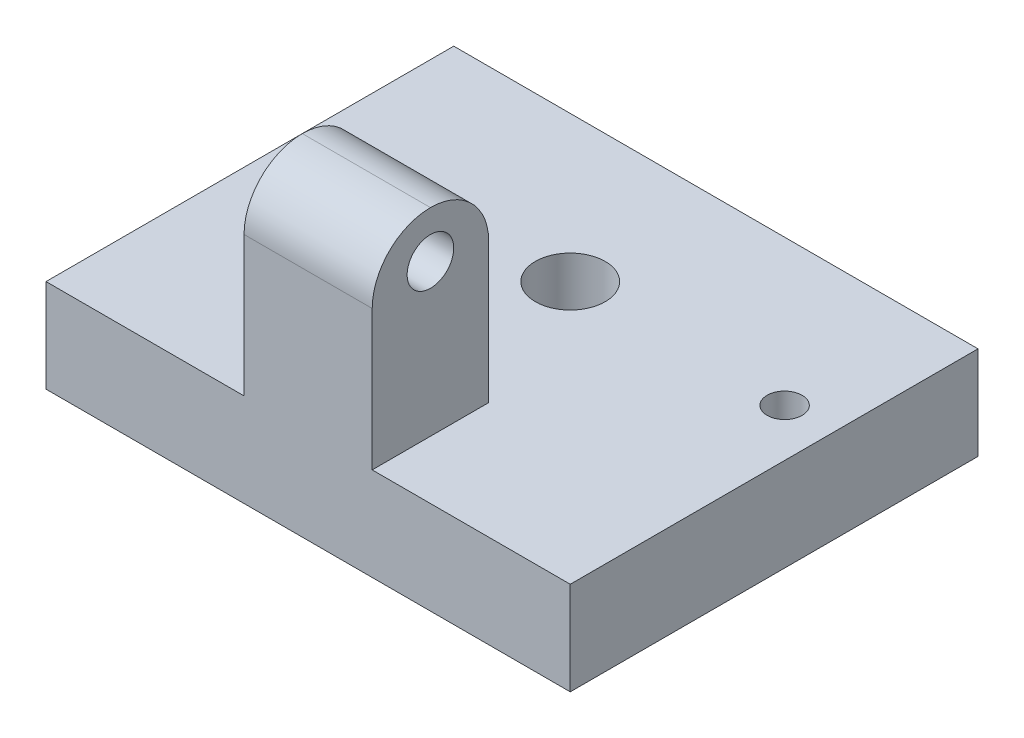
ISO-10303-21;
HEADER;
FILE_DESCRIPTION(('STEP AP214'),'2;1');
FILE_NAME('part.step','',(''),(''),'','','');
FILE_SCHEMA(('AUTOMOTIVE_DESIGN { 1 0 10303 214 1 1 1 1 }'));
ENDSEC;
DATA;
#1=APPLICATION_CONTEXT('core data for automotive mechanical design processes');
#2=APPLICATION_PROTOCOL_DEFINITION('international standard','automotive_design',2000,#1);
#3=PRODUCT_CONTEXT('',#1,'mechanical');
#4=PRODUCT('Part','Part','',(#3));
#5=PRODUCT_RELATED_PRODUCT_CATEGORY('part','',(#4));
#6=PRODUCT_DEFINITION_FORMATION('','',#4);
#7=PRODUCT_DEFINITION_CONTEXT('part definition',#1,'design');
#8=PRODUCT_DEFINITION('design','',#6,#7);
#9=PRODUCT_DEFINITION_SHAPE('','',#8);
#10=(LENGTH_UNIT() NAMED_UNIT(*) SI_UNIT(.MILLI.,.METRE.));
#11=(NAMED_UNIT(*) PLANE_ANGLE_UNIT() SI_UNIT($,.RADIAN.));
#12=(NAMED_UNIT(*) SI_UNIT($,.STERADIAN.) SOLID_ANGLE_UNIT());
#13=UNCERTAINTY_MEASURE_WITH_UNIT(LENGTH_MEASURE(1.E-05),#10,'distance_accuracy_value','');
#14=(GEOMETRIC_REPRESENTATION_CONTEXT(3) GLOBAL_UNCERTAINTY_ASSIGNED_CONTEXT((#13)) GLOBAL_UNIT_ASSIGNED_CONTEXT((#10,
#11,#12)) REPRESENTATION_CONTEXT('',''));
#15=CARTESIAN_POINT('',(0.,0.,0.));
#16=DIRECTION('',(0.,0.,1.));
#17=DIRECTION('',(1.,0.,0.));
#18=AXIS2_PLACEMENT_3D('',#15,#16,#17);
#19=CARTESIAN_POINT('',(0.,0.,0.));
#20=DIRECTION('',(0.,-1.,0.));
#21=DIRECTION('',(0.,0.,-1.));
#22=AXIS2_PLACEMENT_3D('',#19,#20,#21);
#23=PLANE('',#22);
#24=CARTESIAN_POINT('',(-18.4,0.,-5.));
#25=DIRECTION('',(0.,1.,0.));
#26=DIRECTION('',(0.,0.,1.));
#27=AXIS2_PLACEMENT_3D('',#24,#25,#26);
#28=CIRCLE('',#27,1.5);
#29=CARTESIAN_POINT('',(-18.4,0.,-3.5));
#30=VERTEX_POINT('',#29);
#31=EDGE_CURVE('E172',#30,#30,#28,.T.);
#32=ORIENTED_EDGE('',*,*,#31,.T.);
#33=EDGE_LOOP('',(#32));
#34=FACE_BOUND('',#33,.T.);
#35=DIRECTION('',(0.,0.,-1.));
#36=VECTOR('',#35,1.);
#37=CARTESIAN_POINT('',(22.5,0.,17.5));
#38=LINE('',#37,#36);
#39=CARTESIAN_POINT('',(22.5,0.,17.5));
#40=VERTEX_POINT('',#39);
#41=CARTESIAN_POINT('',(22.5,0.,-17.5));
#42=VERTEX_POINT('',#41);
#43=EDGE_CURVE('E178',#40,#42,#38,.T.);
#44=ORIENTED_EDGE('',*,*,#43,.F.);
#45=DIRECTION('',(1.,0.,0.));
#46=VECTOR('',#45,1.);
#47=CARTESIAN_POINT('',(-22.5,0.,17.5));
#48=LINE('',#47,#46);
#49=CARTESIAN_POINT('',(-22.5,0.,17.5));
#50=VERTEX_POINT('',#49);
#51=EDGE_CURVE('E185',#50,#40,#48,.T.);
#52=ORIENTED_EDGE('',*,*,#51,.F.);
#53=DIRECTION('',(0.,0.,1.));
#54=VECTOR('',#53,1.);
#55=CARTESIAN_POINT('',(-22.5,0.,17.5));
#56=LINE('',#55,#54);
#57=CARTESIAN_POINT('',(-22.5,0.,-17.5));
#58=VERTEX_POINT('',#57);
#59=EDGE_CURVE('E183',#58,#50,#56,.T.);
#60=ORIENTED_EDGE('',*,*,#59,.F.);
#61=DIRECTION('',(-1.,0.,0.));
#62=VECTOR('',#61,1.);
#63=CARTESIAN_POINT('',(-22.5,0.,-17.5));
#64=LINE('',#63,#62);
#65=EDGE_CURVE('E181',#42,#58,#64,.T.);
#66=ORIENTED_EDGE('',*,*,#65,.F.);
#67=EDGE_LOOP('',(#44,#52,#60,#66));
#68=FACE_BOUND('',#67,.T.);
#69=CARTESIAN_POINT('',(0.,0.,-5.));
#70=DIRECTION('',(0.,1.,0.));
#71=DIRECTION('',(0.,0.,1.));
#72=AXIS2_PLACEMENT_3D('',#69,#70,#71);
#73=CIRCLE('',#72,3.);
#74=CARTESIAN_POINT('',(0.,0.,-2.));
#75=VERTEX_POINT('',#74);
#76=EDGE_CURVE('E175',#75,#75,#73,.T.);
#77=ORIENTED_EDGE('',*,*,#76,.T.);
#78=EDGE_LOOP('',(#77));
#79=FACE_BOUND('',#78,.T.);
#80=CARTESIAN_POINT('',(18.4,0.,-5.));
#81=DIRECTION('',(0.,1.,0.));
#82=DIRECTION('',(0.,0.,-1.));
#83=AXIS2_PLACEMENT_3D('',#80,#81,#82);
#84=CIRCLE('',#83,1.5);
#85=CARTESIAN_POINT('',(18.4,0.,-6.5));
#86=VERTEX_POINT('',#85);
#87=EDGE_CURVE('E169',#86,#86,#84,.T.);
#88=ORIENTED_EDGE('',*,*,#87,.T.);
#89=EDGE_LOOP('',(#88));
#90=FACE_BOUND('',#89,.T.);
#91=ADVANCED_FACE('F35',(#34,#68,#79,#90),#23,.T.);
#92=CARTESIAN_POINT('',(22.5,5.,17.5));
#93=DIRECTION('',(-1.,0.,0.));
#94=DIRECTION('',(0.,0.,1.));
#95=AXIS2_PLACEMENT_3D('',#92,#93,#94);
#96=PLANE('',#95);
#97=ORIENTED_EDGE('',*,*,#43,.T.);
#98=DIRECTION('',(0.,-1.,0.));
#99=VECTOR('',#98,1.);
#100=CARTESIAN_POINT('',(22.5,5.,-17.5));
#101=LINE('',#100,#99);
#102=CARTESIAN_POINT('',(22.5,8.,-17.5));
#103=VERTEX_POINT('',#102);
#104=EDGE_CURVE('E125',#103,#42,#101,.T.);
#105=ORIENTED_EDGE('',*,*,#104,.F.);
#106=DIRECTION('',(0.,0.,-1.));
#107=VECTOR('',#106,1.);
#108=CARTESIAN_POINT('',(22.5,8.,0.));
#109=LINE('',#108,#107);
#110=CARTESIAN_POINT('',(22.5,8.,17.5));
#111=VERTEX_POINT('',#110);
#112=EDGE_CURVE('E152',#111,#103,#109,.T.);
#113=ORIENTED_EDGE('',*,*,#112,.F.);
#114=DIRECTION('',(0.,-1.,0.));
#115=VECTOR('',#114,1.);
#116=CARTESIAN_POINT('',(22.5,5.,17.5));
#117=LINE('',#116,#115);
#118=EDGE_CURVE('E187',#111,#40,#117,.T.);
#119=ORIENTED_EDGE('',*,*,#118,.T.);
#120=EDGE_LOOP('',(#97,#105,#113,#119));
#121=FACE_BOUND('',#120,.T.);
#122=ADVANCED_FACE('F203',(#121),#96,.F.);
#123=CARTESIAN_POINT('',(-22.5,5.,-17.5));
#124=DIRECTION('',(0.,0.,1.));
#125=DIRECTION('',(1.,0.,0.));
#126=AXIS2_PLACEMENT_3D('',#123,#124,#125);
#127=PLANE('',#126);
#128=ORIENTED_EDGE('',*,*,#65,.T.);
#129=DIRECTION('',(0.,-1.,0.));
#130=VECTOR('',#129,1.);
#131=CARTESIAN_POINT('',(-22.5,5.,-17.5));
#132=LINE('',#131,#130);
#133=CARTESIAN_POINT('',(-22.5,8.,-17.5));
#134=VERTEX_POINT('',#133);
#135=EDGE_CURVE('E193',#134,#58,#132,.T.);
#136=ORIENTED_EDGE('',*,*,#135,.F.);
#137=DIRECTION('',(-1.,0.,0.));
#138=VECTOR('',#137,1.);
#139=CARTESIAN_POINT('',(0.,8.,-17.5));
#140=LINE('',#139,#138);
#141=EDGE_CURVE('E155',#103,#134,#140,.T.);
#142=ORIENTED_EDGE('',*,*,#141,.F.);
#143=ORIENTED_EDGE('',*,*,#104,.T.);
#144=EDGE_LOOP('',(#128,#136,#142,#143));
#145=FACE_BOUND('',#144,.T.);
#146=ADVANCED_FACE('F199',(#145),#127,.F.);
#147=CARTESIAN_POINT('',(-22.5,5.,17.5));
#148=DIRECTION('',(1.,0.,0.));
#149=DIRECTION('',(0.,0.,-1.));
#150=AXIS2_PLACEMENT_3D('',#147,#148,#149);
#151=PLANE('',#150);
#152=ORIENTED_EDGE('',*,*,#59,.T.);
#153=DIRECTION('',(0.,-1.,0.));
#154=VECTOR('',#153,1.);
#155=CARTESIAN_POINT('',(-22.5,5.,17.5));
#156=LINE('',#155,#154);
#157=CARTESIAN_POINT('',(-22.5,8.,17.5));
#158=VERTEX_POINT('',#157);
#159=EDGE_CURVE('E190',#158,#50,#156,.T.);
#160=ORIENTED_EDGE('',*,*,#159,.F.);
#161=DIRECTION('',(0.,0.,1.));
#162=VECTOR('',#161,1.);
#163=CARTESIAN_POINT('',(-22.5,8.,0.));
#164=LINE('',#163,#162);
#165=EDGE_CURVE('E158',#134,#158,#164,.T.);
#166=ORIENTED_EDGE('',*,*,#165,.F.);
#167=ORIENTED_EDGE('',*,*,#135,.T.);
#168=EDGE_LOOP('',(#152,#160,#166,#167));
#169=FACE_BOUND('',#168,.T.);
#170=ADVANCED_FACE('F210',(#169),#151,.F.);
#171=CARTESIAN_POINT('',(-22.5,5.,17.5));
#172=DIRECTION('',(0.,0.,-1.));
#173=DIRECTION('',(-1.,0.,0.));
#174=AXIS2_PLACEMENT_3D('',#171,#172,#173);
#175=PLANE('',#174);
#176=DIRECTION('',(0.,-1.,0.));
#177=VECTOR('',#176,1.);
#178=CARTESIAN_POINT('',(5.5,25.,17.5));
#179=LINE('',#178,#177);
#180=CARTESIAN_POINT('',(5.5,20.,17.5));
#181=VERTEX_POINT('',#180);
#182=CARTESIAN_POINT('',(5.5,8.,17.5));
#183=VERTEX_POINT('',#182);
#184=EDGE_CURVE('E143',#181,#183,#179,.T.);
#185=ORIENTED_EDGE('',*,*,#184,.F.);
#186=DIRECTION('',(1.,0.,0.));
#187=VECTOR('',#186,1.);
#188=CARTESIAN_POINT('',(-5.5,20.,17.5));
#189=LINE('',#188,#187);
#190=CARTESIAN_POINT('',(-5.5,20.,17.5));
#191=VERTEX_POINT('',#190);
#192=EDGE_CURVE('E11',#181,#191,#189,.F.);
#193=ORIENTED_EDGE('',*,*,#192,.T.);
#194=DIRECTION('',(0.,-1.,0.));
#195=VECTOR('',#194,1.);
#196=CARTESIAN_POINT('',(-5.5,25.,17.5));
#197=LINE('',#196,#195);
#198=CARTESIAN_POINT('',(-5.5,8.,17.5));
#199=VERTEX_POINT('',#198);
#200=EDGE_CURVE('E145',#191,#199,#197,.T.);
#201=ORIENTED_EDGE('',*,*,#200,.T.);
#202=DIRECTION('',(1.,0.,0.));
#203=VECTOR('',#202,1.);
#204=CARTESIAN_POINT('',(0.,8.,17.5));
#205=LINE('',#204,#203);
#206=EDGE_CURVE('E131',#158,#199,#205,.T.);
#207=ORIENTED_EDGE('',*,*,#206,.F.);
#208=ORIENTED_EDGE('',*,*,#159,.T.);
#209=ORIENTED_EDGE('',*,*,#51,.T.);
#210=ORIENTED_EDGE('',*,*,#118,.F.);
#211=EDGE_CURVE('E150',#183,#111,#205,.T.);
#212=ORIENTED_EDGE('',*,*,#211,.F.);
#213=EDGE_LOOP('',(#185,#193,#201,#207,#208,#209,#210,#212));
#214=FACE_BOUND('',#213,.T.);
#215=ADVANCED_FACE('F213',(#214),#175,.F.);
#216=CARTESIAN_POINT('',(0.,5.,-5.));
#217=DIRECTION('',(0.,-1.,0.));
#218=DIRECTION('',(0.,0.,-1.));
#219=AXIS2_PLACEMENT_3D('',#216,#217,#218);
#220=CYLINDRICAL_SURFACE('',#219,3.);
#221=ORIENTED_EDGE('',*,*,#76,.F.);
#222=EDGE_LOOP('',(#221));
#223=FACE_BOUND('',#222,.T.);
#224=CARTESIAN_POINT('',(0.,8.,-5.));
#225=DIRECTION('',(0.,1.,0.));
#226=DIRECTION('',(0.,0.,1.));
#227=AXIS2_PLACEMENT_3D('',#224,#225,#226);
#228=CIRCLE('',#227,3.);
#229=CARTESIAN_POINT('',(0.,8.,-2.));
#230=VERTEX_POINT('',#229);
#231=EDGE_CURVE('E160',#230,#230,#228,.F.);
#232=ORIENTED_EDGE('',*,*,#231,.F.);
#233=EDGE_LOOP('',(#232));
#234=FACE_BOUND('',#233,.T.);
#235=ADVANCED_FACE('F235',(#223,#234),#220,.F.);
#236=CARTESIAN_POINT('',(-18.4,5.,-5.));
#237=DIRECTION('',(0.,-1.,0.));
#238=DIRECTION('',(0.,0.,-1.));
#239=AXIS2_PLACEMENT_3D('',#236,#237,#238);
#240=CYLINDRICAL_SURFACE('',#239,1.5);
#241=ORIENTED_EDGE('',*,*,#31,.F.);
#242=EDGE_LOOP('',(#241));
#243=FACE_BOUND('',#242,.T.);
#244=CARTESIAN_POINT('',(-18.4,8.,-5.));
#245=DIRECTION('',(0.,1.,0.));
#246=DIRECTION('',(0.,0.,1.));
#247=AXIS2_PLACEMENT_3D('',#244,#245,#246);
#248=CIRCLE('',#247,1.5);
#249=CARTESIAN_POINT('',(-18.4,8.,-3.5));
#250=VERTEX_POINT('',#249);
#251=EDGE_CURVE('E166',#250,#250,#248,.F.);
#252=ORIENTED_EDGE('',*,*,#251,.F.);
#253=EDGE_LOOP('',(#252));
#254=FACE_BOUND('',#253,.T.);
#255=ADVANCED_FACE('F262',(#243,#254),#240,.F.);
#256=CARTESIAN_POINT('',(18.4,5.,-5.));
#257=DIRECTION('',(0.,-1.,0.));
#258=DIRECTION('',(0.,0.,-1.));
#259=AXIS2_PLACEMENT_3D('',#256,#257,#258);
#260=CYLINDRICAL_SURFACE('',#259,1.5);
#261=ORIENTED_EDGE('',*,*,#87,.F.);
#262=EDGE_LOOP('',(#261));
#263=FACE_BOUND('',#262,.T.);
#264=CARTESIAN_POINT('',(18.4,8.,-5.));
#265=DIRECTION('',(0.,1.,0.));
#266=DIRECTION('',(0.,0.,1.));
#267=AXIS2_PLACEMENT_3D('',#264,#265,#266);
#268=CIRCLE('',#267,1.5);
#269=CARTESIAN_POINT('',(18.4,8.,-3.5));
#270=VERTEX_POINT('',#269);
#271=EDGE_CURVE('E163',#270,#270,#268,.F.);
#272=ORIENTED_EDGE('',*,*,#271,.F.);
#273=EDGE_LOOP('',(#272));
#274=FACE_BOUND('',#273,.T.);
#275=ADVANCED_FACE('F269',(#263,#274),#260,.F.);
#276=CARTESIAN_POINT('',(0.,8.,0.));
#277=DIRECTION('',(0.,1.,0.));
#278=DIRECTION('',(0.,0.,1.));
#279=AXIS2_PLACEMENT_3D('',#276,#277,#278);
#280=PLANE('',#279);
#281=DIRECTION('',(0.,0.,1.));
#282=VECTOR('',#281,1.);
#283=CARTESIAN_POINT('',(-5.5,8.,0.));
#284=LINE('',#283,#282);
#285=CARTESIAN_POINT('',(-5.5,8.,7.50000000000001));
#286=VERTEX_POINT('',#285);
#287=EDGE_CURVE('E108',#286,#199,#284,.T.);
#288=ORIENTED_EDGE('',*,*,#287,.F.);
#289=DIRECTION('',(1.,0.,0.));
#290=VECTOR('',#289,1.);
#291=CARTESIAN_POINT('',(0.,8.,7.50000000000001));
#292=LINE('',#291,#290);
#293=CARTESIAN_POINT('',(5.5,8.,7.50000000000001));
#294=VERTEX_POINT('',#293);
#295=EDGE_CURVE('E119',#286,#294,#292,.T.);
#296=ORIENTED_EDGE('',*,*,#295,.T.);
#297=DIRECTION('',(0.,0.,1.));
#298=VECTOR('',#297,1.);
#299=CARTESIAN_POINT('',(5.5,8.,0.));
#300=LINE('',#299,#298);
#301=EDGE_CURVE('E124',#294,#183,#300,.T.);
#302=ORIENTED_EDGE('',*,*,#301,.T.);
#303=ORIENTED_EDGE('',*,*,#211,.T.);
#304=ORIENTED_EDGE('',*,*,#112,.T.);
#305=ORIENTED_EDGE('',*,*,#141,.T.);
#306=ORIENTED_EDGE('',*,*,#165,.T.);
#307=ORIENTED_EDGE('',*,*,#206,.T.);
#308=EDGE_LOOP('',(#288,#296,#302,#303,#304,#305,#306,#307));
#309=FACE_BOUND('',#308,.T.);
#310=ORIENTED_EDGE('',*,*,#231,.T.);
#311=EDGE_LOOP('',(#310));
#312=FACE_BOUND('',#311,.T.);
#313=ORIENTED_EDGE('',*,*,#271,.T.);
#314=EDGE_LOOP('',(#313));
#315=FACE_BOUND('',#314,.T.);
#316=ORIENTED_EDGE('',*,*,#251,.T.);
#317=EDGE_LOOP('',(#316));
#318=FACE_BOUND('',#317,.T.);
#319=ADVANCED_FACE('F127',(#309,#312,#315,#318),#280,.T.);
#320=CARTESIAN_POINT('',(-5.5,25.,0.));
#321=DIRECTION('',(-1.,0.,0.));
#322=DIRECTION('',(0.,0.,1.));
#323=AXIS2_PLACEMENT_3D('',#320,#321,#322);
#324=PLANE('',#323);
#325=CARTESIAN_POINT('',(-5.5,21.,12.5));
#326=DIRECTION('',(-1.,0.,0.));
#327=DIRECTION('',(0.,0.,1.));
#328=AXIS2_PLACEMENT_3D('',#325,#326,#327);
#329=CIRCLE('',#328,2.);
#330=CARTESIAN_POINT('',(-5.5,21.,14.5));
#331=VERTEX_POINT('',#330);
#332=EDGE_CURVE('E116',#331,#331,#329,.T.);
#333=ORIENTED_EDGE('',*,*,#332,.F.);
#334=EDGE_LOOP('',(#333));
#335=FACE_BOUND('',#334,.T.);
#336=CARTESIAN_POINT('',(-5.5,20.,12.5));
#337=DIRECTION('',(-1.,0.,0.));
#338=DIRECTION('',(0.,0.,1.));
#339=AXIS2_PLACEMENT_3D('',#336,#337,#338);
#340=CIRCLE('',#339,5.);
#341=CARTESIAN_POINT('',(-5.5,25.,12.5));
#342=VERTEX_POINT('',#341);
#343=EDGE_CURVE('E132',#191,#342,#340,.T.);
#344=ORIENTED_EDGE('',*,*,#343,.T.);
#345=CARTESIAN_POINT('',(-5.5,20.,12.5));
#346=DIRECTION('',(-1.,0.,0.));
#347=DIRECTION('',(0.,0.,1.));
#348=AXIS2_PLACEMENT_3D('',#345,#346,#347);
#349=CIRCLE('',#348,5.);
#350=CARTESIAN_POINT('',(-5.5,20.,7.50000000000001));
#351=VERTEX_POINT('',#350);
#352=EDGE_CURVE('E111',#342,#351,#349,.T.);
#353=ORIENTED_EDGE('',*,*,#352,.T.);
#354=DIRECTION('',(0.,-1.,0.));
#355=VECTOR('',#354,1.);
#356=CARTESIAN_POINT('',(-5.5,25.,7.50000000000001));
#357=LINE('',#356,#355);
#358=EDGE_CURVE('E103',#351,#286,#357,.T.);
#359=ORIENTED_EDGE('',*,*,#358,.T.);
#360=ORIENTED_EDGE('',*,*,#287,.T.);
#361=ORIENTED_EDGE('',*,*,#200,.F.);
#362=EDGE_LOOP('',(#344,#353,#359,#360,#361));
#363=FACE_BOUND('',#362,.T.);
#364=ADVANCED_FACE('F105',(#335,#363),#324,.T.);
#365=CARTESIAN_POINT('',(5.5,25.,0.));
#366=DIRECTION('',(-1.,0.,0.));
#367=DIRECTION('',(0.,0.,1.));
#368=AXIS2_PLACEMENT_3D('',#365,#366,#367);
#369=PLANE('',#368);
#370=CARTESIAN_POINT('',(5.5,21.,12.5));
#371=DIRECTION('',(1.,0.,0.));
#372=DIRECTION('',(0.,0.,-1.));
#373=AXIS2_PLACEMENT_3D('',#370,#371,#372);
#374=CIRCLE('',#373,2.);
#375=CARTESIAN_POINT('',(5.5,21.,10.5));
#376=VERTEX_POINT('',#375);
#377=EDGE_CURVE('E219',#376,#376,#374,.T.);
#378=ORIENTED_EDGE('',*,*,#377,.F.);
#379=EDGE_LOOP('',(#378));
#380=FACE_BOUND('',#379,.T.);
#381=DIRECTION('',(0.,-1.,0.));
#382=VECTOR('',#381,1.);
#383=CARTESIAN_POINT('',(5.5,25.,7.50000000000001));
#384=LINE('',#383,#382);
#385=CARTESIAN_POINT('',(5.5,20.,7.50000000000001));
#386=VERTEX_POINT('',#385);
#387=EDGE_CURVE('E115',#386,#294,#384,.T.);
#388=ORIENTED_EDGE('',*,*,#387,.F.);
#389=CARTESIAN_POINT('',(5.5,20.,12.5));
#390=DIRECTION('',(-1.,0.,0.));
#391=DIRECTION('',(0.,0.,1.));
#392=AXIS2_PLACEMENT_3D('',#389,#390,#391);
#393=CIRCLE('',#392,5.);
#394=CARTESIAN_POINT('',(5.5,25.,12.5));
#395=VERTEX_POINT('',#394);
#396=EDGE_CURVE('E44',#386,#395,#393,.F.);
#397=ORIENTED_EDGE('',*,*,#396,.T.);
#398=CARTESIAN_POINT('',(5.5,20.,12.5));
#399=DIRECTION('',(-1.,0.,0.));
#400=DIRECTION('',(0.,0.,1.));
#401=AXIS2_PLACEMENT_3D('',#398,#399,#400);
#402=CIRCLE('',#401,5.);
#403=EDGE_CURVE('E51',#395,#181,#402,.F.);
#404=ORIENTED_EDGE('',*,*,#403,.T.);
#405=ORIENTED_EDGE('',*,*,#184,.T.);
#406=ORIENTED_EDGE('',*,*,#301,.F.);
#407=EDGE_LOOP('',(#388,#397,#404,#405,#406));
#408=FACE_BOUND('',#407,.T.);
#409=ADVANCED_FACE('F142',(#380,#408),#369,.F.);
#410=CARTESIAN_POINT('',(0.,25.,7.50000000000001));
#411=DIRECTION('',(0.,0.,1.));
#412=DIRECTION('',(1.,0.,0.));
#413=AXIS2_PLACEMENT_3D('',#410,#411,#412);
#414=PLANE('',#413);
#415=ORIENTED_EDGE('',*,*,#358,.F.);
#416=DIRECTION('',(-1.,0.,0.));
#417=VECTOR('',#416,1.);
#418=CARTESIAN_POINT('',(5.5,20.,7.50000000000001));
#419=LINE('',#418,#417);
#420=EDGE_CURVE('E138',#351,#386,#419,.F.);
#421=ORIENTED_EDGE('',*,*,#420,.T.);
#422=ORIENTED_EDGE('',*,*,#387,.T.);
#423=ORIENTED_EDGE('',*,*,#295,.F.);
#424=EDGE_LOOP('',(#415,#421,#422,#423));
#425=FACE_BOUND('',#424,.T.);
#426=ADVANCED_FACE('F120',(#425),#414,.F.);
#427=CARTESIAN_POINT('',(-14.5,21.,12.5));
#428=DIRECTION('',(1.,0.,0.));
#429=DIRECTION('',(0.,0.,-1.));
#430=AXIS2_PLACEMENT_3D('',#427,#428,#429);
#431=CYLINDRICAL_SURFACE('',#430,2.);
#432=ORIENTED_EDGE('',*,*,#332,.T.);
#433=EDGE_LOOP('',(#432));
#434=FACE_BOUND('',#433,.T.);
#435=ORIENTED_EDGE('',*,*,#377,.T.);
#436=EDGE_LOOP('',(#435));
#437=FACE_BOUND('',#436,.T.);
#438=ADVANCED_FACE('F225',(#434,#437),#431,.F.);
#439=CARTESIAN_POINT('',(0.,20.,12.5));
#440=DIRECTION('',(-1.,0.,0.));
#441=DIRECTION('',(0.,0.,1.));
#442=AXIS2_PLACEMENT_3D('',#439,#440,#441);
#443=CYLINDRICAL_SURFACE('',#442,5.);
#444=ORIENTED_EDGE('',*,*,#192,.F.);
#445=ORIENTED_EDGE('',*,*,#403,.F.);
#446=DIRECTION('',(1.,0.,0.));
#447=VECTOR('',#446,1.);
#448=CARTESIAN_POINT('',(5.5,25.,12.5));
#449=LINE('',#448,#447);
#450=EDGE_CURVE('E39',#342,#395,#449,.T.);
#451=ORIENTED_EDGE('',*,*,#450,.F.);
#452=ORIENTED_EDGE('',*,*,#343,.F.);
#453=EDGE_LOOP('',(#444,#445,#451,#452));
#454=FACE_BOUND('',#453,.T.);
#455=ADVANCED_FACE('F37',(#454),#443,.T.);
#456=CARTESIAN_POINT('',(0.,20.,12.5));
#457=DIRECTION('',(1.,0.,0.));
#458=DIRECTION('',(0.,0.,-1.));
#459=AXIS2_PLACEMENT_3D('',#456,#457,#458);
#460=CYLINDRICAL_SURFACE('',#459,5.);
#461=ORIENTED_EDGE('',*,*,#396,.F.);
#462=ORIENTED_EDGE('',*,*,#420,.F.);
#463=ORIENTED_EDGE('',*,*,#352,.F.);
#464=ORIENTED_EDGE('',*,*,#450,.T.);
#465=EDGE_LOOP('',(#461,#462,#463,#464));
#466=FACE_BOUND('',#465,.T.);
#467=ADVANCED_FACE('F220',(#466),#460,.T.);
#468=CLOSED_SHELL('',(#91,#122,#146,#170,#215,#235,#255,#275,#319,#364,#409,#426,#438,#455,#467));
#469=MANIFOLD_SOLID_BREP('B2',#468);
#470=ADVANCED_BREP_SHAPE_REPRESENTATION('',(#18,#469),#14);
#471=SHAPE_DEFINITION_REPRESENTATION(#9,#470);
ENDSEC;
END-ISO-10303-21;
